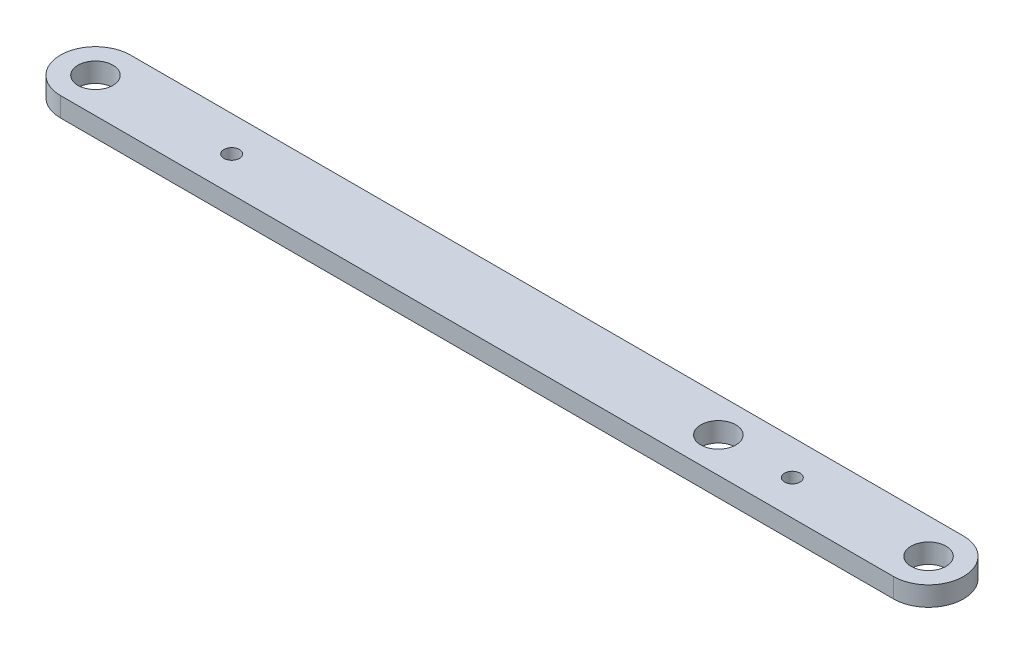
ISO-10303-21;
HEADER;
FILE_DESCRIPTION(('STEP AP214'),'2;1');
FILE_NAME('part.step','',(''),(''),'','','');
FILE_SCHEMA(('AUTOMOTIVE_DESIGN { 1 0 10303 214 1 1 1 1 }'));
ENDSEC;
DATA;
#1=APPLICATION_CONTEXT('core data for automotive mechanical design processes');
#2=APPLICATION_PROTOCOL_DEFINITION('international standard','automotive_design',2000,#1);
#3=PRODUCT_CONTEXT('',#1,'mechanical');
#4=PRODUCT('Part','Part','',(#3));
#5=PRODUCT_RELATED_PRODUCT_CATEGORY('part','',(#4));
#6=PRODUCT_DEFINITION_FORMATION('','',#4);
#7=PRODUCT_DEFINITION_CONTEXT('part definition',#1,'design');
#8=PRODUCT_DEFINITION('design','',#6,#7);
#9=PRODUCT_DEFINITION_SHAPE('','',#8);
#10=(LENGTH_UNIT() NAMED_UNIT(*) SI_UNIT(.MILLI.,.METRE.));
#11=(NAMED_UNIT(*) PLANE_ANGLE_UNIT() SI_UNIT($,.RADIAN.));
#12=(NAMED_UNIT(*) SI_UNIT($,.STERADIAN.) SOLID_ANGLE_UNIT());
#13=UNCERTAINTY_MEASURE_WITH_UNIT(LENGTH_MEASURE(1.E-05),#10,'distance_accuracy_value','');
#14=(GEOMETRIC_REPRESENTATION_CONTEXT(3) GLOBAL_UNCERTAINTY_ASSIGNED_CONTEXT((#13)) GLOBAL_UNIT_ASSIGNED_CONTEXT((#10,
#11,#12)) REPRESENTATION_CONTEXT('',''));
#15=CARTESIAN_POINT('',(0.,0.,0.));
#16=DIRECTION('',(0.,0.,1.));
#17=DIRECTION('',(1.,0.,0.));
#18=AXIS2_PLACEMENT_3D('',#15,#16,#17);
#19=CARTESIAN_POINT('',(-140.60973467266,5.,-14.4238178633976));
#20=DIRECTION('',(0.,1.,0.));
#21=DIRECTION('',(0.,0.,1.));
#22=AXIS2_PLACEMENT_3D('',#19,#20,#21);
#23=PLANE('',#22);
#24=CARTESIAN_POINT('',(38.3902653273404,5.,-14.4238178633975));
#25=DIRECTION('',(0.,1.,0.));
#26=DIRECTION('',(0.,0.,1.));
#27=AXIS2_PLACEMENT_3D('',#24,#25,#26);
#28=CIRCLE('',#27,2.);
#29=CARTESIAN_POINT('',(38.3902653273404,5.,-12.4238178633975));
#30=VERTEX_POINT('',#29);
#31=EDGE_CURVE('E150',#30,#30,#28,.T.);
#32=ORIENTED_EDGE('',*,*,#31,.F.);
#33=EDGE_LOOP('',(#32));
#34=FACE_BOUND('',#33,.T.);
#35=CARTESIAN_POINT('',(-140.60973467266,5.,-14.4238178633976));
#36=DIRECTION('',(0.,1.,0.));
#37=DIRECTION('',(0.,0.,1.));
#38=AXIS2_PLACEMENT_3D('',#35,#36,#37);
#39=CIRCLE('',#38,4.49999999999999);
#40=CARTESIAN_POINT('',(-140.60973467266,5.,-9.92381786339757));
#41=VERTEX_POINT('',#40);
#42=EDGE_CURVE('E134',#41,#41,#39,.T.);
#43=ORIENTED_EDGE('',*,*,#42,.F.);
#44=EDGE_LOOP('',(#43));
#45=FACE_BOUND('',#44,.T.);
#46=CARTESIAN_POINT('',(-140.60973467266,5.,-14.4238178633976));
#47=DIRECTION('',(0.,1.,0.));
#48=DIRECTION('',(0.,0.,1.));
#49=AXIS2_PLACEMENT_3D('',#46,#47,#48);
#50=CIRCLE('',#49,9.);
#51=CARTESIAN_POINT('',(-140.60973467266,5.,-23.4238178633976));
#52=VERTEX_POINT('',#51);
#53=CARTESIAN_POINT('',(-140.60973467266,5.,-5.42381786339756));
#54=VERTEX_POINT('',#53);
#55=EDGE_CURVE('E92',#52,#54,#50,.T.);
#56=ORIENTED_EDGE('',*,*,#55,.T.);
#57=DIRECTION('',(1.,0.,0.));
#58=VECTOR('',#57,1.);
#59=CARTESIAN_POINT('',(73.3902653273404,5.,-5.42381786339759));
#60=LINE('',#59,#58);
#61=CARTESIAN_POINT('',(73.3902653273404,5.,-5.42381786339757));
#62=VERTEX_POINT('',#61);
#63=EDGE_CURVE('E87',#54,#62,#60,.T.);
#64=ORIENTED_EDGE('',*,*,#63,.T.);
#65=CARTESIAN_POINT('',(73.3902653273404,5.,-14.4238178633976));
#66=DIRECTION('',(0.,1.,0.));
#67=DIRECTION('',(0.,0.,1.));
#68=AXIS2_PLACEMENT_3D('',#65,#66,#67);
#69=CIRCLE('',#68,8.99999999999998);
#70=CARTESIAN_POINT('',(73.3902653273404,5.,-23.4238178633976));
#71=VERTEX_POINT('',#70);
#72=EDGE_CURVE('E90',#62,#71,#69,.T.);
#73=ORIENTED_EDGE('',*,*,#72,.T.);
#74=DIRECTION('',(-1.,0.,0.));
#75=VECTOR('',#74,1.);
#76=CARTESIAN_POINT('',(-140.60973467266,5.,-23.4238178633976));
#77=LINE('',#76,#75);
#78=EDGE_CURVE('E57',#71,#52,#77,.T.);
#79=ORIENTED_EDGE('',*,*,#78,.T.);
#80=EDGE_LOOP('',(#56,#64,#73,#79));
#81=FACE_BOUND('',#80,.T.);
#82=CARTESIAN_POINT('',(73.3902653273404,5.,-14.4238178633976));
#83=DIRECTION('',(0.,1.,0.));
#84=DIRECTION('',(0.,0.,1.));
#85=AXIS2_PLACEMENT_3D('',#82,#83,#84);
#86=CIRCLE('',#85,4.5);
#87=CARTESIAN_POINT('',(73.3902653273404,5.,-9.92381786339755));
#88=VERTEX_POINT('',#87);
#89=EDGE_CURVE('E112',#88,#88,#86,.T.);
#90=ORIENTED_EDGE('',*,*,#89,.F.);
#91=EDGE_LOOP('',(#90));
#92=FACE_BOUND('',#91,.T.);
#93=CARTESIAN_POINT('',(-105.60973467266,5.,-14.4238178633976));
#94=DIRECTION('',(0.,1.,0.));
#95=DIRECTION('',(0.,0.,1.));
#96=AXIS2_PLACEMENT_3D('',#93,#94,#95);
#97=CIRCLE('',#96,2.);
#98=CARTESIAN_POINT('',(-105.60973467266,5.,-12.4238178633976));
#99=VERTEX_POINT('',#98);
#100=EDGE_CURVE('E142',#99,#99,#97,.T.);
#101=ORIENTED_EDGE('',*,*,#100,.F.);
#102=EDGE_LOOP('',(#101));
#103=FACE_BOUND('',#102,.T.);
#104=CARTESIAN_POINT('',(19.3902653273404,5.,-14.4238178633975));
#105=DIRECTION('',(0.,1.,0.));
#106=DIRECTION('',(0.,0.,1.));
#107=AXIS2_PLACEMENT_3D('',#104,#105,#106);
#108=CIRCLE('',#107,4.5);
#109=CARTESIAN_POINT('',(19.3902653273404,5.,-9.92381786339755));
#110=VERTEX_POINT('',#109);
#111=EDGE_CURVE('E158',#110,#110,#108,.T.);
#112=ORIENTED_EDGE('',*,*,#111,.F.);
#113=EDGE_LOOP('',(#112));
#114=FACE_BOUND('',#113,.T.);
#115=ADVANCED_FACE('F39',(#34,#45,#81,#92,#103,#114),#23,.T.);
#116=CARTESIAN_POINT('',(-140.60973467266,0.,-14.4238178633976));
#117=DIRECTION('',(0.,1.,0.));
#118=DIRECTION('',(0.,0.,1.));
#119=AXIS2_PLACEMENT_3D('',#116,#117,#118);
#120=PLANE('',#119);
#121=CARTESIAN_POINT('',(-140.60973467266,0.,-14.4238178633976));
#122=DIRECTION('',(0.,1.,0.));
#123=DIRECTION('',(0.,0.,1.));
#124=AXIS2_PLACEMENT_3D('',#121,#122,#123);
#125=CIRCLE('',#124,9.);
#126=CARTESIAN_POINT('',(-140.60973467266,0.,-23.4238178633976));
#127=VERTEX_POINT('',#126);
#128=CARTESIAN_POINT('',(-140.60973467266,0.,-5.42381786339756));
#129=VERTEX_POINT('',#128);
#130=EDGE_CURVE('E108',#127,#129,#125,.T.);
#131=ORIENTED_EDGE('',*,*,#130,.F.);
#132=DIRECTION('',(-1.,0.,0.));
#133=VECTOR('',#132,1.);
#134=CARTESIAN_POINT('',(-140.60973467266,0.,-23.4238178633976));
#135=LINE('',#134,#133);
#136=CARTESIAN_POINT('',(73.3902653273404,0.,-23.4238178633976));
#137=VERTEX_POINT('',#136);
#138=EDGE_CURVE('E80',#137,#127,#135,.T.);
#139=ORIENTED_EDGE('',*,*,#138,.F.);
#140=CARTESIAN_POINT('',(73.3902653273404,0.,-14.4238178633976));
#141=DIRECTION('',(0.,1.,0.));
#142=DIRECTION('',(0.,0.,1.));
#143=AXIS2_PLACEMENT_3D('',#140,#141,#142);
#144=CIRCLE('',#143,8.99999999999998);
#145=CARTESIAN_POINT('',(73.3902653273404,0.,-5.42381786339757));
#146=VERTEX_POINT('',#145);
#147=EDGE_CURVE('E74',#146,#137,#144,.T.);
#148=ORIENTED_EDGE('',*,*,#147,.F.);
#149=DIRECTION('',(1.,0.,0.));
#150=VECTOR('',#149,1.);
#151=CARTESIAN_POINT('',(73.3902653273404,0.,-5.42381786339759));
#152=LINE('',#151,#150);
#153=EDGE_CURVE('E97',#129,#146,#152,.T.);
#154=ORIENTED_EDGE('',*,*,#153,.F.);
#155=EDGE_LOOP('',(#131,#139,#148,#154));
#156=FACE_BOUND('',#155,.T.);
#157=CARTESIAN_POINT('',(73.3902653273404,0.,-14.4238178633976));
#158=DIRECTION('',(0.,1.,0.));
#159=DIRECTION('',(0.,0.,1.));
#160=AXIS2_PLACEMENT_3D('',#157,#158,#159);
#161=CIRCLE('',#160,4.5);
#162=CARTESIAN_POINT('',(73.3902653273404,0.,-9.92381786339755));
#163=VERTEX_POINT('',#162);
#164=EDGE_CURVE('E130',#163,#163,#161,.T.);
#165=ORIENTED_EDGE('',*,*,#164,.T.);
#166=EDGE_LOOP('',(#165));
#167=FACE_BOUND('',#166,.T.);
#168=CARTESIAN_POINT('',(-140.60973467266,0.,-14.4238178633976));
#169=DIRECTION('',(0.,1.,0.));
#170=DIRECTION('',(0.,0.,1.));
#171=AXIS2_PLACEMENT_3D('',#168,#169,#170);
#172=CIRCLE('',#171,4.49999999999999);
#173=CARTESIAN_POINT('',(-140.60973467266,0.,-9.92381786339757));
#174=VERTEX_POINT('',#173);
#175=EDGE_CURVE('E138',#174,#174,#172,.T.);
#176=ORIENTED_EDGE('',*,*,#175,.T.);
#177=EDGE_LOOP('',(#176));
#178=FACE_BOUND('',#177,.T.);
#179=CARTESIAN_POINT('',(-105.60973467266,0.,-14.4238178633976));
#180=DIRECTION('',(0.,1.,0.));
#181=DIRECTION('',(0.,0.,1.));
#182=AXIS2_PLACEMENT_3D('',#179,#180,#181);
#183=CIRCLE('',#182,2.);
#184=CARTESIAN_POINT('',(-105.60973467266,0.,-12.4238178633976));
#185=VERTEX_POINT('',#184);
#186=EDGE_CURVE('E146',#185,#185,#183,.T.);
#187=ORIENTED_EDGE('',*,*,#186,.T.);
#188=EDGE_LOOP('',(#187));
#189=FACE_BOUND('',#188,.T.);
#190=CARTESIAN_POINT('',(38.3902653273404,0.,-14.4238178633975));
#191=DIRECTION('',(0.,1.,0.));
#192=DIRECTION('',(0.,0.,1.));
#193=AXIS2_PLACEMENT_3D('',#190,#191,#192);
#194=CIRCLE('',#193,2.);
#195=CARTESIAN_POINT('',(38.3902653273404,0.,-12.4238178633975));
#196=VERTEX_POINT('',#195);
#197=EDGE_CURVE('E154',#196,#196,#194,.T.);
#198=ORIENTED_EDGE('',*,*,#197,.T.);
#199=EDGE_LOOP('',(#198));
#200=FACE_BOUND('',#199,.T.);
#201=CARTESIAN_POINT('',(19.3902653273404,0.,-14.4238178633975));
#202=DIRECTION('',(0.,1.,0.));
#203=DIRECTION('',(0.,0.,1.));
#204=AXIS2_PLACEMENT_3D('',#201,#202,#203);
#205=CIRCLE('',#204,4.5);
#206=CARTESIAN_POINT('',(19.3902653273404,0.,-9.92381786339755));
#207=VERTEX_POINT('',#206);
#208=EDGE_CURVE('E162',#207,#207,#205,.T.);
#209=ORIENTED_EDGE('',*,*,#208,.T.);
#210=EDGE_LOOP('',(#209));
#211=FACE_BOUND('',#210,.T.);
#212=ADVANCED_FACE('F125',(#156,#167,#178,#189,#200,#211),#120,.F.);
#213=CARTESIAN_POINT('',(-140.60973467266,5.,-14.4238178633976));
#214=DIRECTION('',(0.,-1.,0.));
#215=DIRECTION('',(0.,0.,-1.));
#216=AXIS2_PLACEMENT_3D('',#213,#214,#215);
#217=CYLINDRICAL_SURFACE('',#216,9.);
#218=ORIENTED_EDGE('',*,*,#130,.T.);
#219=DIRECTION('',(0.,-1.,0.));
#220=VECTOR('',#219,1.);
#221=CARTESIAN_POINT('',(-140.60973467266,5.,-5.42381786339756));
#222=LINE('',#221,#220);
#223=EDGE_CURVE('E11',#54,#129,#222,.T.);
#224=ORIENTED_EDGE('',*,*,#223,.F.);
#225=ORIENTED_EDGE('',*,*,#55,.F.);
#226=DIRECTION('',(0.,-1.,0.));
#227=VECTOR('',#226,1.);
#228=CARTESIAN_POINT('',(-140.60973467266,5.,-23.4238178633976));
#229=LINE('',#228,#227);
#230=EDGE_CURVE('E104',#52,#127,#229,.T.);
#231=ORIENTED_EDGE('',*,*,#230,.T.);
#232=EDGE_LOOP('',(#218,#224,#225,#231));
#233=FACE_BOUND('',#232,.T.);
#234=ADVANCED_FACE('F41',(#233),#217,.T.);
#235=CARTESIAN_POINT('',(73.3902653273404,5.,-5.42381786339759));
#236=DIRECTION('',(0.,0.,-1.));
#237=DIRECTION('',(-1.,0.,0.));
#238=AXIS2_PLACEMENT_3D('',#235,#236,#237);
#239=PLANE('',#238);
#240=ORIENTED_EDGE('',*,*,#153,.T.);
#241=DIRECTION('',(0.,-1.,0.));
#242=VECTOR('',#241,1.);
#243=CARTESIAN_POINT('',(73.3902653273404,5.,-5.42381786339757));
#244=LINE('',#243,#242);
#245=EDGE_CURVE('E49',#62,#146,#244,.T.);
#246=ORIENTED_EDGE('',*,*,#245,.F.);
#247=ORIENTED_EDGE('',*,*,#63,.F.);
#248=ORIENTED_EDGE('',*,*,#223,.T.);
#249=EDGE_LOOP('',(#240,#246,#247,#248));
#250=FACE_BOUND('',#249,.T.);
#251=ADVANCED_FACE('F96',(#250),#239,.F.);
#252=CARTESIAN_POINT('',(73.3902653273404,5.,-14.4238178633976));
#253=DIRECTION('',(0.,-1.,0.));
#254=DIRECTION('',(0.,0.,-1.));
#255=AXIS2_PLACEMENT_3D('',#252,#253,#254);
#256=CYLINDRICAL_SURFACE('',#255,8.99999999999998);
#257=ORIENTED_EDGE('',*,*,#147,.T.);
#258=DIRECTION('',(0.,-1.,0.));
#259=VECTOR('',#258,1.);
#260=CARTESIAN_POINT('',(73.3902653273404,5.,-23.4238178633976));
#261=LINE('',#260,#259);
#262=EDGE_CURVE('E99',#71,#137,#261,.T.);
#263=ORIENTED_EDGE('',*,*,#262,.F.);
#264=ORIENTED_EDGE('',*,*,#72,.F.);
#265=ORIENTED_EDGE('',*,*,#245,.T.);
#266=EDGE_LOOP('',(#257,#263,#264,#265));
#267=FACE_BOUND('',#266,.T.);
#268=ADVANCED_FACE('F100',(#267),#256,.T.);
#269=CARTESIAN_POINT('',(-140.60973467266,5.,-23.4238178633976));
#270=DIRECTION('',(0.,0.,1.));
#271=DIRECTION('',(1.,0.,0.));
#272=AXIS2_PLACEMENT_3D('',#269,#270,#271);
#273=PLANE('',#272);
#274=ORIENTED_EDGE('',*,*,#138,.T.);
#275=ORIENTED_EDGE('',*,*,#230,.F.);
#276=ORIENTED_EDGE('',*,*,#78,.F.);
#277=ORIENTED_EDGE('',*,*,#262,.T.);
#278=EDGE_LOOP('',(#274,#275,#276,#277));
#279=FACE_BOUND('',#278,.T.);
#280=ADVANCED_FACE('F122',(#279),#273,.F.);
#281=CARTESIAN_POINT('',(73.3902653273404,5.,-14.4238178633976));
#282=DIRECTION('',(0.,-1.,0.));
#283=DIRECTION('',(0.,0.,-1.));
#284=AXIS2_PLACEMENT_3D('',#281,#282,#283);
#285=CYLINDRICAL_SURFACE('',#284,4.5);
#286=ORIENTED_EDGE('',*,*,#89,.T.);
#287=EDGE_LOOP('',(#286));
#288=FACE_BOUND('',#287,.T.);
#289=ORIENTED_EDGE('',*,*,#164,.F.);
#290=EDGE_LOOP('',(#289));
#291=FACE_BOUND('',#290,.T.);
#292=ADVANCED_FACE('F183',(#288,#291),#285,.F.);
#293=CARTESIAN_POINT('',(-140.60973467266,5.,-14.4238178633976));
#294=DIRECTION('',(0.,-1.,0.));
#295=DIRECTION('',(0.,0.,-1.));
#296=AXIS2_PLACEMENT_3D('',#293,#294,#295);
#297=CYLINDRICAL_SURFACE('',#296,4.49999999999999);
#298=ORIENTED_EDGE('',*,*,#42,.T.);
#299=EDGE_LOOP('',(#298));
#300=FACE_BOUND('',#299,.T.);
#301=ORIENTED_EDGE('',*,*,#175,.F.);
#302=EDGE_LOOP('',(#301));
#303=FACE_BOUND('',#302,.T.);
#304=ADVANCED_FACE('F229',(#300,#303),#297,.F.);
#305=CARTESIAN_POINT('',(-105.60973467266,5.,-14.4238178633976));
#306=DIRECTION('',(0.,-1.,0.));
#307=DIRECTION('',(0.,0.,-1.));
#308=AXIS2_PLACEMENT_3D('',#305,#306,#307);
#309=CYLINDRICAL_SURFACE('',#308,2.);
#310=ORIENTED_EDGE('',*,*,#100,.T.);
#311=EDGE_LOOP('',(#310));
#312=FACE_BOUND('',#311,.T.);
#313=ORIENTED_EDGE('',*,*,#186,.F.);
#314=EDGE_LOOP('',(#313));
#315=FACE_BOUND('',#314,.T.);
#316=ADVANCED_FACE('F237',(#312,#315),#309,.F.);
#317=CARTESIAN_POINT('',(38.3902653273404,5.,-14.4238178633975));
#318=DIRECTION('',(0.,-1.,0.));
#319=DIRECTION('',(0.,0.,-1.));
#320=AXIS2_PLACEMENT_3D('',#317,#318,#319);
#321=CYLINDRICAL_SURFACE('',#320,2.);
#322=ORIENTED_EDGE('',*,*,#31,.T.);
#323=EDGE_LOOP('',(#322));
#324=FACE_BOUND('',#323,.T.);
#325=ORIENTED_EDGE('',*,*,#197,.F.);
#326=EDGE_LOOP('',(#325));
#327=FACE_BOUND('',#326,.T.);
#328=ADVANCED_FACE('F245',(#324,#327),#321,.F.);
#329=CARTESIAN_POINT('',(19.3902653273404,5.,-14.4238178633975));
#330=DIRECTION('',(0.,-1.,0.));
#331=DIRECTION('',(0.,0.,-1.));
#332=AXIS2_PLACEMENT_3D('',#329,#330,#331);
#333=CYLINDRICAL_SURFACE('',#332,4.5);
#334=ORIENTED_EDGE('',*,*,#111,.T.);
#335=EDGE_LOOP('',(#334));
#336=FACE_BOUND('',#335,.T.);
#337=ORIENTED_EDGE('',*,*,#208,.F.);
#338=EDGE_LOOP('',(#337));
#339=FACE_BOUND('',#338,.T.);
#340=ADVANCED_FACE('F170',(#336,#339),#333,.F.);
#341=CLOSED_SHELL('',(#115,#212,#234,#251,#268,#280,#292,#304,#316,#328,#340));
#342=MANIFOLD_SOLID_BREP('B2',#341);
#343=ADVANCED_BREP_SHAPE_REPRESENTATION('',(#18,#342),#14);
#344=SHAPE_DEFINITION_REPRESENTATION(#9,#343);
ENDSEC;
END-ISO-10303-21;
